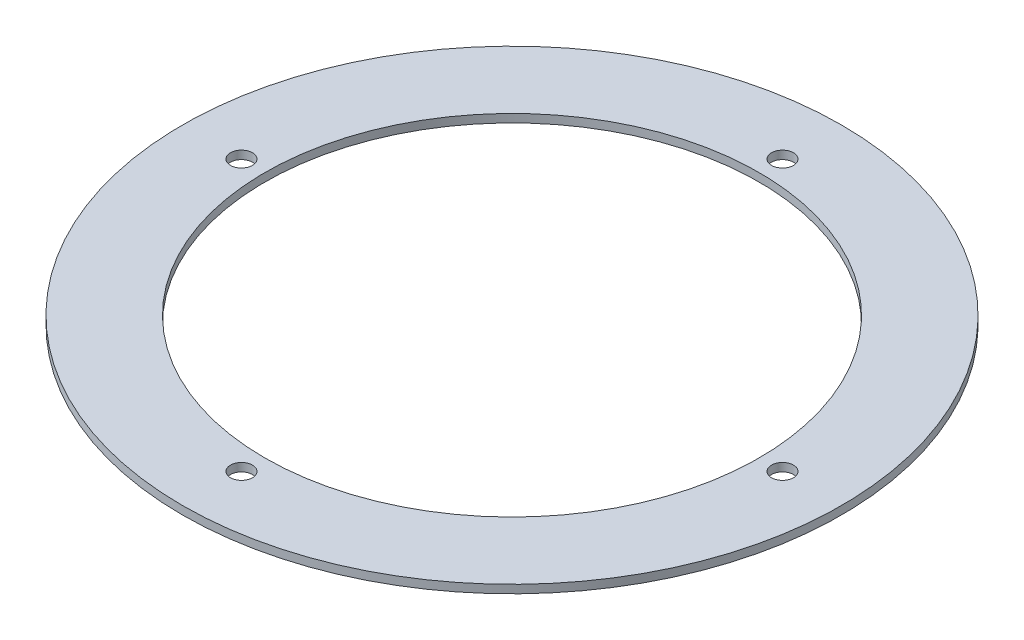
ISO-10303-21;
HEADER;
FILE_DESCRIPTION(('STEP AP214'),'2;1');
FILE_NAME('part.step','',(''),(''),'','','');
FILE_SCHEMA(('AUTOMOTIVE_DESIGN { 1 0 10303 214 1 1 1 1 }'));
ENDSEC;
DATA;
#1=APPLICATION_CONTEXT('core data for automotive mechanical design processes');
#2=APPLICATION_PROTOCOL_DEFINITION('international standard','automotive_design',2000,#1);
#3=PRODUCT_CONTEXT('',#1,'mechanical');
#4=PRODUCT('Part','Part','',(#3));
#5=PRODUCT_RELATED_PRODUCT_CATEGORY('part','',(#4));
#6=PRODUCT_DEFINITION_FORMATION('','',#4);
#7=PRODUCT_DEFINITION_CONTEXT('part definition',#1,'design');
#8=PRODUCT_DEFINITION('design','',#6,#7);
#9=PRODUCT_DEFINITION_SHAPE('','',#8);
#10=(LENGTH_UNIT() NAMED_UNIT(*) SI_UNIT(.MILLI.,.METRE.));
#11=(NAMED_UNIT(*) PLANE_ANGLE_UNIT() SI_UNIT($,.RADIAN.));
#12=(NAMED_UNIT(*) SI_UNIT($,.STERADIAN.) SOLID_ANGLE_UNIT());
#13=UNCERTAINTY_MEASURE_WITH_UNIT(LENGTH_MEASURE(1.E-05),#10,'distance_accuracy_value','');
#14=(GEOMETRIC_REPRESENTATION_CONTEXT(3) GLOBAL_UNCERTAINTY_ASSIGNED_CONTEXT((#13)) GLOBAL_UNIT_ASSIGNED_CONTEXT((#10,
#11,#12)) REPRESENTATION_CONTEXT('',''));
#15=CARTESIAN_POINT('',(0.,0.,0.));
#16=DIRECTION('',(0.,0.,1.));
#17=DIRECTION('',(1.,0.,0.));
#18=AXIS2_PLACEMENT_3D('',#15,#16,#17);
#19=CARTESIAN_POINT('',(0.,1.5,0.));
#20=DIRECTION('',(0.,1.,0.));
#21=DIRECTION('',(0.,0.,1.));
#22=AXIS2_PLACEMENT_3D('',#19,#20,#21);
#23=PLANE('',#22);
#24=CARTESIAN_POINT('',(49.25,1.5,3.43910911876049E-13));
#25=DIRECTION('',(0.,1.,0.));
#26=DIRECTION('',(0.,0.,1.));
#27=AXIS2_PLACEMENT_3D('',#24,#25,#26);
#28=CIRCLE('',#27,2.00000000000001);
#29=CARTESIAN_POINT('',(49.25,1.5,2.00000000000035));
#30=VERTEX_POINT('',#29);
#31=EDGE_CURVE('E73',#30,#30,#28,.T.);
#32=ORIENTED_EDGE('',*,*,#31,.F.);
#33=EDGE_LOOP('',(#32));
#34=FACE_BOUND('',#33,.T.);
#35=CARTESIAN_POINT('',(1.71955455938024E-13,1.5,-49.25));
#36=DIRECTION('',(0.,1.,0.));
#37=DIRECTION('',(0.,0.,1.));
#38=AXIS2_PLACEMENT_3D('',#35,#36,#37);
#39=CIRCLE('',#38,2.);
#40=CARTESIAN_POINT('',(1.71955455938024E-13,1.5,-47.25));
#41=VERTEX_POINT('',#40);
#42=EDGE_CURVE('E61',#41,#41,#39,.T.);
#43=ORIENTED_EDGE('',*,*,#42,.F.);
#44=EDGE_LOOP('',(#43));
#45=FACE_BOUND('',#44,.T.);
#46=CARTESIAN_POINT('',(0.,1.5,0.));
#47=DIRECTION('',(0.,1.,0.));
#48=DIRECTION('',(0.,0.,1.));
#49=AXIS2_PLACEMENT_3D('',#46,#47,#48);
#50=CIRCLE('',#49,60.);
#51=CARTESIAN_POINT('',(0.,1.5,60.));
#52=VERTEX_POINT('',#51);
#53=EDGE_CURVE('E10',#52,#52,#50,.T.);
#54=ORIENTED_EDGE('',*,*,#53,.T.);
#55=EDGE_LOOP('',(#54));
#56=FACE_BOUND('',#55,.T.);
#57=CARTESIAN_POINT('',(0.,1.5,0.));
#58=DIRECTION('',(0.,1.,0.));
#59=DIRECTION('',(0.,0.,1.));
#60=AXIS2_PLACEMENT_3D('',#57,#58,#59);
#61=CIRCLE('',#60,45.);
#62=CARTESIAN_POINT('',(0.,1.5,45.));
#63=VERTEX_POINT('',#62);
#64=EDGE_CURVE('E56',#63,#63,#61,.T.);
#65=ORIENTED_EDGE('',*,*,#64,.F.);
#66=EDGE_LOOP('',(#65));
#67=FACE_BOUND('',#66,.T.);
#68=CARTESIAN_POINT('',(-49.25,1.5,0.));
#69=DIRECTION('',(0.,1.,0.));
#70=DIRECTION('',(0.,0.,1.));
#71=AXIS2_PLACEMENT_3D('',#68,#69,#70);
#72=CIRCLE('',#71,2.);
#73=CARTESIAN_POINT('',(-49.25,1.5,2.));
#74=VERTEX_POINT('',#73);
#75=EDGE_CURVE('E67',#74,#74,#72,.T.);
#76=ORIENTED_EDGE('',*,*,#75,.F.);
#77=EDGE_LOOP('',(#76));
#78=FACE_BOUND('',#77,.T.);
#79=CARTESIAN_POINT('',(-5.15866367814073E-13,1.5,49.25));
#80=DIRECTION('',(0.,1.,0.));
#81=DIRECTION('',(0.,0.,1.));
#82=AXIS2_PLACEMENT_3D('',#79,#80,#81);
#83=CIRCLE('',#82,2.);
#84=CARTESIAN_POINT('',(-5.15866367814073E-13,1.5,51.25));
#85=VERTEX_POINT('',#84);
#86=EDGE_CURVE('E79',#85,#85,#83,.T.);
#87=ORIENTED_EDGE('',*,*,#86,.F.);
#88=EDGE_LOOP('',(#87));
#89=FACE_BOUND('',#88,.T.);
#90=ADVANCED_FACE('F45',(#34,#45,#56,#67,#78,#89),#23,.T.);
#91=CARTESIAN_POINT('',(0.,0.,0.));
#92=DIRECTION('',(0.,1.,0.));
#93=DIRECTION('',(0.,0.,1.));
#94=AXIS2_PLACEMENT_3D('',#91,#92,#93);
#95=PLANE('',#94);
#96=CARTESIAN_POINT('',(0.,0.,0.));
#97=DIRECTION('',(0.,1.,0.));
#98=DIRECTION('',(0.,0.,1.));
#99=AXIS2_PLACEMENT_3D('',#96,#97,#98);
#100=CIRCLE('',#99,60.);
#101=CARTESIAN_POINT('',(0.,0.,60.));
#102=VERTEX_POINT('',#101);
#103=EDGE_CURVE('E49',#102,#102,#100,.T.);
#104=ORIENTED_EDGE('',*,*,#103,.F.);
#105=EDGE_LOOP('',(#104));
#106=FACE_BOUND('',#105,.T.);
#107=CARTESIAN_POINT('',(0.,0.,0.));
#108=DIRECTION('',(0.,1.,0.));
#109=DIRECTION('',(0.,0.,1.));
#110=AXIS2_PLACEMENT_3D('',#107,#108,#109);
#111=CIRCLE('',#110,45.);
#112=CARTESIAN_POINT('',(0.,0.,45.));
#113=VERTEX_POINT('',#112);
#114=EDGE_CURVE('E58',#113,#113,#111,.T.);
#115=ORIENTED_EDGE('',*,*,#114,.T.);
#116=EDGE_LOOP('',(#115));
#117=FACE_BOUND('',#116,.T.);
#118=CARTESIAN_POINT('',(1.71955455938024E-13,0.,-49.25));
#119=DIRECTION('',(0.,1.,0.));
#120=DIRECTION('',(0.,0.,1.));
#121=AXIS2_PLACEMENT_3D('',#118,#119,#120);
#122=CIRCLE('',#121,2.);
#123=CARTESIAN_POINT('',(1.71955455938024E-13,0.,-47.25));
#124=VERTEX_POINT('',#123);
#125=EDGE_CURVE('E64',#124,#124,#122,.T.);
#126=ORIENTED_EDGE('',*,*,#125,.T.);
#127=EDGE_LOOP('',(#126));
#128=FACE_BOUND('',#127,.T.);
#129=CARTESIAN_POINT('',(-49.25,0.,0.));
#130=DIRECTION('',(0.,1.,0.));
#131=DIRECTION('',(0.,0.,1.));
#132=AXIS2_PLACEMENT_3D('',#129,#130,#131);
#133=CIRCLE('',#132,2.);
#134=CARTESIAN_POINT('',(-49.25,0.,2.));
#135=VERTEX_POINT('',#134);
#136=EDGE_CURVE('E70',#135,#135,#133,.T.);
#137=ORIENTED_EDGE('',*,*,#136,.T.);
#138=EDGE_LOOP('',(#137));
#139=FACE_BOUND('',#138,.T.);
#140=CARTESIAN_POINT('',(49.25,0.,3.43910911876049E-13));
#141=DIRECTION('',(0.,1.,0.));
#142=DIRECTION('',(0.,0.,1.));
#143=AXIS2_PLACEMENT_3D('',#140,#141,#142);
#144=CIRCLE('',#143,2.00000000000001);
#145=CARTESIAN_POINT('',(49.25,0.,2.00000000000035));
#146=VERTEX_POINT('',#145);
#147=EDGE_CURVE('E76',#146,#146,#144,.T.);
#148=ORIENTED_EDGE('',*,*,#147,.T.);
#149=EDGE_LOOP('',(#148));
#150=FACE_BOUND('',#149,.T.);
#151=CARTESIAN_POINT('',(-5.15866367814073E-13,0.,49.25));
#152=DIRECTION('',(0.,1.,0.));
#153=DIRECTION('',(0.,0.,1.));
#154=AXIS2_PLACEMENT_3D('',#151,#152,#153);
#155=CIRCLE('',#154,2.);
#156=CARTESIAN_POINT('',(-5.15866367814073E-13,0.,51.25));
#157=VERTEX_POINT('',#156);
#158=EDGE_CURVE('E82',#157,#157,#155,.T.);
#159=ORIENTED_EDGE('',*,*,#158,.T.);
#160=EDGE_LOOP('',(#159));
#161=FACE_BOUND('',#160,.T.);
#162=ADVANCED_FACE('F92',(#106,#117,#128,#139,#150,#161),#95,.F.);
#163=CARTESIAN_POINT('',(0.,1.5,0.));
#164=DIRECTION('',(0.,-1.,0.));
#165=DIRECTION('',(0.,0.,-1.));
#166=AXIS2_PLACEMENT_3D('',#163,#164,#165);
#167=CYLINDRICAL_SURFACE('',#166,60.);
#168=ORIENTED_EDGE('',*,*,#53,.F.);
#169=EDGE_LOOP('',(#168));
#170=FACE_BOUND('',#169,.T.);
#171=ORIENTED_EDGE('',*,*,#103,.T.);
#172=EDGE_LOOP('',(#171));
#173=FACE_BOUND('',#172,.T.);
#174=ADVANCED_FACE('F47',(#170,#173),#167,.T.);
#175=CARTESIAN_POINT('',(0.,1.5,0.));
#176=DIRECTION('',(0.,-1.,0.));
#177=DIRECTION('',(0.,0.,-1.));
#178=AXIS2_PLACEMENT_3D('',#175,#176,#177);
#179=CYLINDRICAL_SURFACE('',#178,45.);
#180=ORIENTED_EDGE('',*,*,#64,.T.);
#181=EDGE_LOOP('',(#180));
#182=FACE_BOUND('',#181,.T.);
#183=ORIENTED_EDGE('',*,*,#114,.F.);
#184=EDGE_LOOP('',(#183));
#185=FACE_BOUND('',#184,.T.);
#186=ADVANCED_FACE('F102',(#182,#185),#179,.F.);
#187=CARTESIAN_POINT('',(1.71955455938024E-13,1.5,-49.25));
#188=DIRECTION('',(0.,-1.,0.));
#189=DIRECTION('',(0.,0.,-1.));
#190=AXIS2_PLACEMENT_3D('',#187,#188,#189);
#191=CYLINDRICAL_SURFACE('',#190,2.);
#192=ORIENTED_EDGE('',*,*,#42,.T.);
#193=EDGE_LOOP('',(#192));
#194=FACE_BOUND('',#193,.T.);
#195=ORIENTED_EDGE('',*,*,#125,.F.);
#196=EDGE_LOOP('',(#195));
#197=FACE_BOUND('',#196,.T.);
#198=ADVANCED_FACE('F105',(#194,#197),#191,.F.);
#199=CARTESIAN_POINT('',(-49.25,1.5,0.));
#200=DIRECTION('',(0.,-1.,0.));
#201=DIRECTION('',(0.,0.,-1.));
#202=AXIS2_PLACEMENT_3D('',#199,#200,#201);
#203=CYLINDRICAL_SURFACE('',#202,2.);
#204=ORIENTED_EDGE('',*,*,#75,.T.);
#205=EDGE_LOOP('',(#204));
#206=FACE_BOUND('',#205,.T.);
#207=ORIENTED_EDGE('',*,*,#136,.F.);
#208=EDGE_LOOP('',(#207));
#209=FACE_BOUND('',#208,.T.);
#210=ADVANCED_FACE('F109',(#206,#209),#203,.F.);
#211=CARTESIAN_POINT('',(49.25,1.5,3.43910911876049E-13));
#212=DIRECTION('',(0.,-1.,0.));
#213=DIRECTION('',(0.,0.,-1.));
#214=AXIS2_PLACEMENT_3D('',#211,#212,#213);
#215=CYLINDRICAL_SURFACE('',#214,2.00000000000001);
#216=ORIENTED_EDGE('',*,*,#31,.T.);
#217=EDGE_LOOP('',(#216));
#218=FACE_BOUND('',#217,.T.);
#219=ORIENTED_EDGE('',*,*,#147,.F.);
#220=EDGE_LOOP('',(#219));
#221=FACE_BOUND('',#220,.T.);
#222=ADVANCED_FACE('F113',(#218,#221),#215,.F.);
#223=CARTESIAN_POINT('',(-5.15866367814073E-13,1.5,49.25));
#224=DIRECTION('',(0.,-1.,0.));
#225=DIRECTION('',(0.,0.,-1.));
#226=AXIS2_PLACEMENT_3D('',#223,#224,#225);
#227=CYLINDRICAL_SURFACE('',#226,2.);
#228=ORIENTED_EDGE('',*,*,#86,.T.);
#229=EDGE_LOOP('',(#228));
#230=FACE_BOUND('',#229,.T.);
#231=ORIENTED_EDGE('',*,*,#158,.F.);
#232=EDGE_LOOP('',(#231));
#233=FACE_BOUND('',#232,.T.);
#234=ADVANCED_FACE('F88',(#230,#233),#227,.F.);
#235=CLOSED_SHELL('',(#90,#162,#174,#186,#198,#210,#222,#234));
#236=MANIFOLD_SOLID_BREP('B2',#235);
#237=ADVANCED_BREP_SHAPE_REPRESENTATION('',(#18,#236),#14);
#238=SHAPE_DEFINITION_REPRESENTATION(#9,#237);
ENDSEC;
END-ISO-10303-21;
